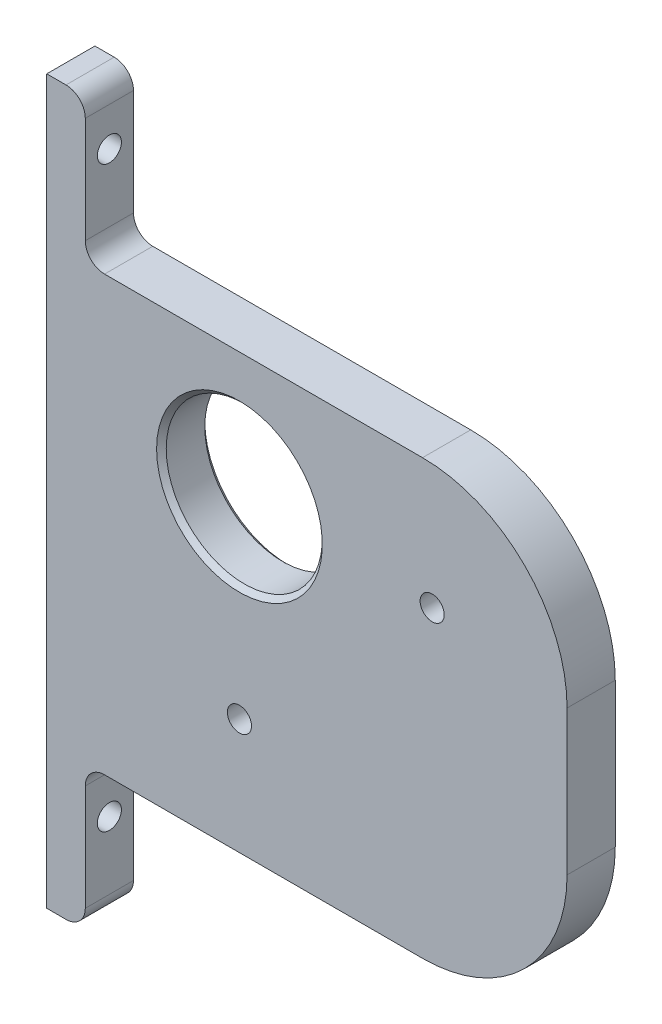
ISO-10303-21;
HEADER;
FILE_DESCRIPTION(('STEP AP214'),'2;1');
FILE_NAME('part.step','',(''),(''),'','','');
FILE_SCHEMA(('AUTOMOTIVE_DESIGN { 1 0 10303 214 1 1 1 1 }'));
ENDSEC;
DATA;
#1=APPLICATION_CONTEXT('core data for automotive mechanical design processes');
#2=APPLICATION_PROTOCOL_DEFINITION('international standard','automotive_design',2000,#1);
#3=PRODUCT_CONTEXT('',#1,'mechanical');
#4=PRODUCT('Part','Part','',(#3));
#5=PRODUCT_RELATED_PRODUCT_CATEGORY('part','',(#4));
#6=PRODUCT_DEFINITION_FORMATION('','',#4);
#7=PRODUCT_DEFINITION_CONTEXT('part definition',#1,'design');
#8=PRODUCT_DEFINITION('design','',#6,#7);
#9=PRODUCT_DEFINITION_SHAPE('','',#8);
#10=(LENGTH_UNIT() NAMED_UNIT(*) SI_UNIT(.MILLI.,.METRE.));
#11=(NAMED_UNIT(*) PLANE_ANGLE_UNIT() SI_UNIT($,.RADIAN.));
#12=(NAMED_UNIT(*) SI_UNIT($,.STERADIAN.) SOLID_ANGLE_UNIT());
#13=UNCERTAINTY_MEASURE_WITH_UNIT(LENGTH_MEASURE(1.E-05),#10,'distance_accuracy_value','');
#14=(GEOMETRIC_REPRESENTATION_CONTEXT(3) GLOBAL_UNCERTAINTY_ASSIGNED_CONTEXT((#13)) GLOBAL_UNIT_ASSIGNED_CONTEXT((#10,
#11,#12)) REPRESENTATION_CONTEXT('',''));
#15=CARTESIAN_POINT('',(0.,0.,0.));
#16=DIRECTION('',(0.,0.,1.));
#17=DIRECTION('',(1.,0.,0.));
#18=AXIS2_PLACEMENT_3D('',#15,#16,#17);
#19=CARTESIAN_POINT('',(0.,0.,5.));
#20=DIRECTION('',(0.,0.,-1.));
#21=DIRECTION('',(-1.,0.,0.));
#22=AXIS2_PLACEMENT_3D('',#19,#20,#21);
#23=PLANE('',#22);
#24=CARTESIAN_POINT('',(20.,47.,5.));
#25=DIRECTION('',(0.,0.,-1.));
#26=DIRECTION('',(-1.,0.,0.));
#27=AXIS2_PLACEMENT_3D('',#24,#25,#26);
#28=CIRCLE('',#27,8.6);
#29=CARTESIAN_POINT('',(11.4,47.,5.));
#30=VERTEX_POINT('',#29);
#31=EDGE_CURVE('E188',#30,#30,#28,.T.);
#32=ORIENTED_EDGE('',*,*,#31,.T.);
#33=EDGE_LOOP('',(#32));
#34=FACE_BOUND('',#33,.T.);
#35=CARTESIAN_POINT('',(40.,47.,5.));
#36=DIRECTION('',(0.,0.,-1.));
#37=DIRECTION('',(-1.,0.,0.));
#38=AXIS2_PLACEMENT_3D('',#35,#36,#37);
#39=CIRCLE('',#38,1.25);
#40=CARTESIAN_POINT('',(38.75,47.,5.));
#41=VERTEX_POINT('',#40);
#42=EDGE_CURVE('E296',#41,#41,#39,.T.);
#43=ORIENTED_EDGE('',*,*,#42,.T.);
#44=EDGE_LOOP('',(#43));
#45=FACE_BOUND('',#44,.T.);
#46=CARTESIAN_POINT('',(20.,27.,5.));
#47=DIRECTION('',(0.,0.,-1.));
#48=DIRECTION('',(-1.,0.,0.));
#49=AXIS2_PLACEMENT_3D('',#46,#47,#48);
#50=CIRCLE('',#49,1.25);
#51=CARTESIAN_POINT('',(18.75,27.,5.));
#52=VERTEX_POINT('',#51);
#53=EDGE_CURVE('E305',#52,#52,#50,.T.);
#54=ORIENTED_EDGE('',*,*,#53,.T.);
#55=EDGE_LOOP('',(#54));
#56=FACE_BOUND('',#55,.T.);
#57=DIRECTION('',(1.,0.,0.));
#58=VECTOR('',#57,1.);
#59=CARTESIAN_POINT('',(4.,15.,5.));
#60=LINE('',#59,#58);
#61=CARTESIAN_POINT('',(6.,15.,5.));
#62=VERTEX_POINT('',#61);
#63=CARTESIAN_POINT('',(39.,15.,5.));
#64=VERTEX_POINT('',#63);
#65=EDGE_CURVE('E245',#62,#64,#60,.T.);
#66=ORIENTED_EDGE('',*,*,#65,.T.);
#67=CARTESIAN_POINT('',(39.,30.,5.));
#68=DIRECTION('',(0.,0.,-1.));
#69=DIRECTION('',(-1.,0.,0.));
#70=AXIS2_PLACEMENT_3D('',#67,#68,#69);
#71=CIRCLE('',#70,15.);
#72=CARTESIAN_POINT('',(54.,30.,5.));
#73=VERTEX_POINT('',#72);
#74=EDGE_CURVE('E54',#64,#73,#71,.F.);
#75=ORIENTED_EDGE('',*,*,#74,.T.);
#76=DIRECTION('',(0.,1.,0.));
#77=VECTOR('',#76,1.);
#78=CARTESIAN_POINT('',(54.,0.,5.));
#79=LINE('',#78,#77);
#80=CARTESIAN_POINT('',(54.,45.,5.));
#81=VERTEX_POINT('',#80);
#82=EDGE_CURVE('E241',#73,#81,#79,.T.);
#83=ORIENTED_EDGE('',*,*,#82,.T.);
#84=CARTESIAN_POINT('',(39.,45.,5.));
#85=DIRECTION('',(0.,0.,-1.));
#86=DIRECTION('',(-1.,0.,0.));
#87=AXIS2_PLACEMENT_3D('',#84,#85,#86);
#88=CIRCLE('',#87,15.);
#89=CARTESIAN_POINT('',(39.,60.,5.));
#90=VERTEX_POINT('',#89);
#91=EDGE_CURVE('E65',#81,#90,#88,.F.);
#92=ORIENTED_EDGE('',*,*,#91,.T.);
#93=DIRECTION('',(-1.,0.,0.));
#94=VECTOR('',#93,1.);
#95=CARTESIAN_POINT('',(4.,60.,5.));
#96=LINE('',#95,#94);
#97=CARTESIAN_POINT('',(6.,60.,5.));
#98=VERTEX_POINT('',#97);
#99=EDGE_CURVE('E287',#90,#98,#96,.T.);
#100=ORIENTED_EDGE('',*,*,#99,.T.);
#101=CARTESIAN_POINT('',(6.,62.,5.));
#102=DIRECTION('',(0.,0.,-1.));
#103=DIRECTION('',(-1.,0.,0.));
#104=AXIS2_PLACEMENT_3D('',#101,#102,#103);
#105=CIRCLE('',#104,2.);
#106=CARTESIAN_POINT('',(4.,62.,5.));
#107=VERTEX_POINT('',#106);
#108=EDGE_CURVE('E225',#98,#107,#105,.T.);
#109=ORIENTED_EDGE('',*,*,#108,.T.);
#110=DIRECTION('',(0.,1.,0.));
#111=VECTOR('',#110,1.);
#112=CARTESIAN_POINT('',(4.,60.,5.));
#113=LINE('',#112,#111);
#114=CARTESIAN_POINT('',(4.,73.,5.));
#115=VERTEX_POINT('',#114);
#116=EDGE_CURVE('E284',#107,#115,#113,.T.);
#117=ORIENTED_EDGE('',*,*,#116,.T.);
#118=CARTESIAN_POINT('',(2.,73.,5.));
#119=DIRECTION('',(0.,0.,-1.));
#120=DIRECTION('',(-1.,0.,0.));
#121=AXIS2_PLACEMENT_3D('',#118,#119,#120);
#122=CIRCLE('',#121,2.);
#123=CARTESIAN_POINT('',(2.,75.,5.));
#124=VERTEX_POINT('',#123);
#125=EDGE_CURVE('E205',#115,#124,#122,.F.);
#126=ORIENTED_EDGE('',*,*,#125,.T.);
#127=DIRECTION('',(-1.,0.,0.));
#128=VECTOR('',#127,1.);
#129=CARTESIAN_POINT('',(0.,75.,5.));
#130=LINE('',#129,#128);
#131=CARTESIAN_POINT('',(0.,75.,5.));
#132=VERTEX_POINT('',#131);
#133=EDGE_CURVE('E166',#124,#132,#130,.T.);
#134=ORIENTED_EDGE('',*,*,#133,.T.);
#135=DIRECTION('',(0.,-1.,0.));
#136=VECTOR('',#135,1.);
#137=CARTESIAN_POINT('',(0.,0.,5.));
#138=LINE('',#137,#136);
#139=CARTESIAN_POINT('',(0.,0.,5.));
#140=VERTEX_POINT('',#139);
#141=EDGE_CURVE('E165',#132,#140,#138,.T.);
#142=ORIENTED_EDGE('',*,*,#141,.T.);
#143=DIRECTION('',(1.,0.,0.));
#144=VECTOR('',#143,1.);
#145=CARTESIAN_POINT('',(0.,0.,5.));
#146=LINE('',#145,#144);
#147=CARTESIAN_POINT('',(2.,0.,5.));
#148=VERTEX_POINT('',#147);
#149=EDGE_CURVE('E151',#140,#148,#146,.T.);
#150=ORIENTED_EDGE('',*,*,#149,.T.);
#151=CARTESIAN_POINT('',(2.,2.,5.));
#152=DIRECTION('',(0.,0.,-1.));
#153=DIRECTION('',(-1.,0.,0.));
#154=AXIS2_PLACEMENT_3D('',#151,#152,#153);
#155=CIRCLE('',#154,2.);
#156=CARTESIAN_POINT('',(4.,2.,5.));
#157=VERTEX_POINT('',#156);
#158=EDGE_CURVE('E203',#148,#157,#155,.F.);
#159=ORIENTED_EDGE('',*,*,#158,.T.);
#160=DIRECTION('',(0.,1.,0.));
#161=VECTOR('',#160,1.);
#162=CARTESIAN_POINT('',(4.,0.,5.));
#163=LINE('',#162,#161);
#164=CARTESIAN_POINT('',(4.,13.,5.));
#165=VERTEX_POINT('',#164);
#166=EDGE_CURVE('E162',#157,#165,#163,.T.);
#167=ORIENTED_EDGE('',*,*,#166,.T.);
#168=CARTESIAN_POINT('',(6.,13.,5.));
#169=DIRECTION('',(0.,0.,-1.));
#170=DIRECTION('',(-1.,0.,0.));
#171=AXIS2_PLACEMENT_3D('',#168,#169,#170);
#172=CIRCLE('',#171,2.);
#173=EDGE_CURVE('E230',#165,#62,#172,.T.);
#174=ORIENTED_EDGE('',*,*,#173,.T.);
#175=EDGE_LOOP('',(#66,#75,#83,#92,#100,#109,#117,#126,#134,#142,#150,#159,#167,#174));
#176=FACE_BOUND('',#175,.T.);
#177=ADVANCED_FACE('F50',(#34,#45,#56,#176),#23,.F.);
#178=CARTESIAN_POINT('',(0.,0.,0.));
#179=DIRECTION('',(0.,0.,-1.));
#180=DIRECTION('',(-1.,0.,0.));
#181=AXIS2_PLACEMENT_3D('',#178,#179,#180);
#182=PLANE('',#181);
#183=DIRECTION('',(0.,1.,0.));
#184=VECTOR('',#183,1.);
#185=CARTESIAN_POINT('',(54.,60.,0.));
#186=LINE('',#185,#184);
#187=CARTESIAN_POINT('',(54.,30.,0.));
#188=VERTEX_POINT('',#187);
#189=CARTESIAN_POINT('',(54.,45.,0.));
#190=VERTEX_POINT('',#189);
#191=EDGE_CURVE('E251',#188,#190,#186,.T.);
#192=ORIENTED_EDGE('',*,*,#191,.F.);
#193=CARTESIAN_POINT('',(39.,30.,0.));
#194=DIRECTION('',(0.,0.,-1.));
#195=DIRECTION('',(-1.,0.,0.));
#196=AXIS2_PLACEMENT_3D('',#193,#194,#195);
#197=CIRCLE('',#196,15.);
#198=CARTESIAN_POINT('',(39.,15.,0.));
#199=VERTEX_POINT('',#198);
#200=EDGE_CURVE('E237',#188,#199,#197,.T.);
#201=ORIENTED_EDGE('',*,*,#200,.T.);
#202=DIRECTION('',(1.,0.,0.));
#203=VECTOR('',#202,1.);
#204=CARTESIAN_POINT('',(4.,15.,0.));
#205=LINE('',#204,#203);
#206=CARTESIAN_POINT('',(6.,15.,0.));
#207=VERTEX_POINT('',#206);
#208=EDGE_CURVE('E256',#207,#199,#205,.T.);
#209=ORIENTED_EDGE('',*,*,#208,.F.);
#210=CARTESIAN_POINT('',(6.,13.,0.));
#211=DIRECTION('',(0.,0.,-1.));
#212=DIRECTION('',(-1.,0.,0.));
#213=AXIS2_PLACEMENT_3D('',#210,#211,#212);
#214=CIRCLE('',#213,2.);
#215=CARTESIAN_POINT('',(4.,13.,0.));
#216=VERTEX_POINT('',#215);
#217=EDGE_CURVE('E222',#207,#216,#214,.F.);
#218=ORIENTED_EDGE('',*,*,#217,.T.);
#219=DIRECTION('',(0.,1.,0.));
#220=VECTOR('',#219,1.);
#221=CARTESIAN_POINT('',(4.,0.,0.));
#222=LINE('',#221,#220);
#223=CARTESIAN_POINT('',(4.,2.,0.));
#224=VERTEX_POINT('',#223);
#225=EDGE_CURVE('E265',#224,#216,#222,.T.);
#226=ORIENTED_EDGE('',*,*,#225,.F.);
#227=CARTESIAN_POINT('',(2.,2.,0.));
#228=DIRECTION('',(0.,0.,-1.));
#229=DIRECTION('',(-1.,0.,0.));
#230=AXIS2_PLACEMENT_3D('',#227,#228,#229);
#231=CIRCLE('',#230,2.);
#232=CARTESIAN_POINT('',(2.,0.,0.));
#233=VERTEX_POINT('',#232);
#234=EDGE_CURVE('E197',#224,#233,#231,.T.);
#235=ORIENTED_EDGE('',*,*,#234,.T.);
#236=DIRECTION('',(1.,0.,0.));
#237=VECTOR('',#236,1.);
#238=CARTESIAN_POINT('',(0.,0.,0.));
#239=LINE('',#238,#237);
#240=CARTESIAN_POINT('',(0.,0.,0.));
#241=VERTEX_POINT('',#240);
#242=EDGE_CURVE('E270',#241,#233,#239,.T.);
#243=ORIENTED_EDGE('',*,*,#242,.F.);
#244=DIRECTION('',(0.,-1.,0.));
#245=VECTOR('',#244,1.);
#246=CARTESIAN_POINT('',(0.,0.,0.));
#247=LINE('',#246,#245);
#248=CARTESIAN_POINT('',(0.,75.,0.));
#249=VERTEX_POINT('',#248);
#250=EDGE_CURVE('E173',#249,#241,#247,.T.);
#251=ORIENTED_EDGE('',*,*,#250,.F.);
#252=DIRECTION('',(-1.,0.,0.));
#253=VECTOR('',#252,1.);
#254=CARTESIAN_POINT('',(0.,75.,0.));
#255=LINE('',#254,#253);
#256=CARTESIAN_POINT('',(2.,75.,0.));
#257=VERTEX_POINT('',#256);
#258=EDGE_CURVE('E169',#257,#249,#255,.T.);
#259=ORIENTED_EDGE('',*,*,#258,.F.);
#260=CARTESIAN_POINT('',(2.,73.,0.));
#261=DIRECTION('',(0.,0.,-1.));
#262=DIRECTION('',(-1.,0.,0.));
#263=AXIS2_PLACEMENT_3D('',#260,#261,#262);
#264=CIRCLE('',#263,2.);
#265=CARTESIAN_POINT('',(4.,73.,0.));
#266=VERTEX_POINT('',#265);
#267=EDGE_CURVE('E200',#257,#266,#264,.T.);
#268=ORIENTED_EDGE('',*,*,#267,.T.);
#269=DIRECTION('',(0.,1.,0.));
#270=VECTOR('',#269,1.);
#271=CARTESIAN_POINT('',(4.,60.,0.));
#272=LINE('',#271,#270);
#273=CARTESIAN_POINT('',(4.,62.,0.));
#274=VERTEX_POINT('',#273);
#275=EDGE_CURVE('E264',#274,#266,#272,.T.);
#276=ORIENTED_EDGE('',*,*,#275,.F.);
#277=CARTESIAN_POINT('',(6.,62.,0.));
#278=DIRECTION('',(0.,0.,-1.));
#279=DIRECTION('',(-1.,0.,0.));
#280=AXIS2_PLACEMENT_3D('',#277,#278,#279);
#281=CIRCLE('',#280,2.);
#282=CARTESIAN_POINT('',(6.,60.,0.));
#283=VERTEX_POINT('',#282);
#284=EDGE_CURVE('E219',#274,#283,#281,.F.);
#285=ORIENTED_EDGE('',*,*,#284,.T.);
#286=DIRECTION('',(-1.,0.,0.));
#287=VECTOR('',#286,1.);
#288=CARTESIAN_POINT('',(4.,60.,0.));
#289=LINE('',#288,#287);
#290=CARTESIAN_POINT('',(39.,60.,0.));
#291=VERTEX_POINT('',#290);
#292=EDGE_CURVE('E263',#291,#283,#289,.T.);
#293=ORIENTED_EDGE('',*,*,#292,.F.);
#294=CARTESIAN_POINT('',(39.,45.,0.));
#295=DIRECTION('',(0.,0.,-1.));
#296=DIRECTION('',(-1.,0.,0.));
#297=AXIS2_PLACEMENT_3D('',#294,#295,#296);
#298=CIRCLE('',#297,15.);
#299=EDGE_CURVE('E234',#291,#190,#298,.T.);
#300=ORIENTED_EDGE('',*,*,#299,.T.);
#301=EDGE_LOOP('',(#192,#201,#209,#218,#226,#235,#243,#251,#259,#268,#276,#285,#293,#300));
#302=FACE_BOUND('',#301,.T.);
#303=CARTESIAN_POINT('',(20.,47.,0.));
#304=DIRECTION('',(0.,0.,-1.));
#305=DIRECTION('',(-1.,0.,0.));
#306=AXIS2_PLACEMENT_3D('',#303,#304,#305);
#307=CIRCLE('',#306,8.60000000000001);
#308=CARTESIAN_POINT('',(11.4,47.,0.));
#309=VERTEX_POINT('',#308);
#310=EDGE_CURVE('E189',#309,#309,#307,.F.);
#311=ORIENTED_EDGE('',*,*,#310,.T.);
#312=EDGE_LOOP('',(#311));
#313=FACE_BOUND('',#312,.T.);
#314=CARTESIAN_POINT('',(40.,47.,0.));
#315=DIRECTION('',(0.,0.,-1.));
#316=DIRECTION('',(-1.,0.,0.));
#317=AXIS2_PLACEMENT_3D('',#314,#315,#316);
#318=CIRCLE('',#317,1.25);
#319=CARTESIAN_POINT('',(38.75,47.,0.));
#320=VERTEX_POINT('',#319);
#321=EDGE_CURVE('E304',#320,#320,#318,.T.);
#322=ORIENTED_EDGE('',*,*,#321,.F.);
#323=EDGE_LOOP('',(#322));
#324=FACE_BOUND('',#323,.T.);
#325=CARTESIAN_POINT('',(20.,27.,0.));
#326=DIRECTION('',(0.,0.,-1.));
#327=DIRECTION('',(-1.,0.,0.));
#328=AXIS2_PLACEMENT_3D('',#325,#326,#327);
#329=CIRCLE('',#328,1.25);
#330=CARTESIAN_POINT('',(18.75,27.,0.));
#331=VERTEX_POINT('',#330);
#332=EDGE_CURVE('E247',#331,#331,#329,.T.);
#333=ORIENTED_EDGE('',*,*,#332,.F.);
#334=EDGE_LOOP('',(#333));
#335=FACE_BOUND('',#334,.T.);
#336=ADVANCED_FACE('F258',(#302,#313,#324,#335),#182,.T.);
#337=CARTESIAN_POINT('',(0.,0.,5.));
#338=DIRECTION('',(1.,0.,0.));
#339=DIRECTION('',(0.,0.,-1.));
#340=AXIS2_PLACEMENT_3D('',#337,#338,#339);
#341=PLANE('',#340);
#342=CARTESIAN_POINT('',(0.,69.,2.5));
#343=DIRECTION('',(1.,0.,0.));
#344=DIRECTION('',(0.,0.,-1.));
#345=AXIS2_PLACEMENT_3D('',#342,#343,#344);
#346=CIRCLE('',#345,1.25);
#347=CARTESIAN_POINT('',(0.,69.,1.25));
#348=VERTEX_POINT('',#347);
#349=EDGE_CURVE('E278',#348,#348,#346,.T.);
#350=ORIENTED_EDGE('',*,*,#349,.T.);
#351=EDGE_LOOP('',(#350));
#352=FACE_BOUND('',#351,.T.);
#353=CARTESIAN_POINT('',(0.,9.,2.5));
#354=DIRECTION('',(1.,0.,0.));
#355=DIRECTION('',(0.,0.,-1.));
#356=AXIS2_PLACEMENT_3D('',#353,#354,#355);
#357=CIRCLE('',#356,1.25);
#358=CARTESIAN_POINT('',(0.,9.,1.25));
#359=VERTEX_POINT('',#358);
#360=EDGE_CURVE('E276',#359,#359,#357,.T.);
#361=ORIENTED_EDGE('',*,*,#360,.T.);
#362=EDGE_LOOP('',(#361));
#363=FACE_BOUND('',#362,.T.);
#364=ORIENTED_EDGE('',*,*,#250,.T.);
#365=DIRECTION('',(0.,0.,-1.));
#366=VECTOR('',#365,1.);
#367=CARTESIAN_POINT('',(0.,0.,5.));
#368=LINE('',#367,#366);
#369=EDGE_CURVE('E157',#140,#241,#368,.T.);
#370=ORIENTED_EDGE('',*,*,#369,.F.);
#371=ORIENTED_EDGE('',*,*,#141,.F.);
#372=DIRECTION('',(0.,0.,-1.));
#373=VECTOR('',#372,1.);
#374=CARTESIAN_POINT('',(0.,75.,5.));
#375=LINE('',#374,#373);
#376=EDGE_CURVE('E176',#132,#249,#375,.T.);
#377=ORIENTED_EDGE('',*,*,#376,.T.);
#378=EDGE_LOOP('',(#364,#370,#371,#377));
#379=FACE_BOUND('',#378,.T.);
#380=ADVANCED_FACE('F171',(#352,#363,#379),#341,.F.);
#381=CARTESIAN_POINT('',(0.,0.,5.));
#382=DIRECTION('',(0.,1.,0.));
#383=DIRECTION('',(0.,0.,1.));
#384=AXIS2_PLACEMENT_3D('',#381,#382,#383);
#385=PLANE('',#384);
#386=ORIENTED_EDGE('',*,*,#242,.T.);
#387=DIRECTION('',(0.,0.,-1.));
#388=VECTOR('',#387,1.);
#389=CARTESIAN_POINT('',(2.,0.,5.));
#390=LINE('',#389,#388);
#391=EDGE_CURVE('E159',#233,#148,#390,.F.);
#392=ORIENTED_EDGE('',*,*,#391,.T.);
#393=ORIENTED_EDGE('',*,*,#149,.F.);
#394=ORIENTED_EDGE('',*,*,#369,.T.);
#395=EDGE_LOOP('',(#386,#392,#393,#394));
#396=FACE_BOUND('',#395,.T.);
#397=ADVANCED_FACE('F152',(#396),#385,.F.);
#398=CARTESIAN_POINT('',(4.,0.,5.));
#399=DIRECTION('',(-1.,0.,0.));
#400=DIRECTION('',(0.,0.,1.));
#401=AXIS2_PLACEMENT_3D('',#398,#399,#400);
#402=PLANE('',#401);
#403=CARTESIAN_POINT('',(4.,9.,2.5));
#404=DIRECTION('',(1.,0.,0.));
#405=DIRECTION('',(0.,0.,1.));
#406=AXIS2_PLACEMENT_3D('',#403,#404,#405);
#407=CIRCLE('',#406,1.25);
#408=CARTESIAN_POINT('',(4.,9.,3.75));
#409=VERTEX_POINT('',#408);
#410=EDGE_CURVE('E293',#409,#409,#407,.T.);
#411=ORIENTED_EDGE('',*,*,#410,.F.);
#412=EDGE_LOOP('',(#411));
#413=FACE_BOUND('',#412,.T.);
#414=ORIENTED_EDGE('',*,*,#166,.F.);
#415=DIRECTION('',(0.,0.,-1.));
#416=VECTOR('',#415,1.);
#417=CARTESIAN_POINT('',(4.,2.,5.));
#418=LINE('',#417,#416);
#419=EDGE_CURVE('E192',#157,#224,#418,.T.);
#420=ORIENTED_EDGE('',*,*,#419,.T.);
#421=ORIENTED_EDGE('',*,*,#225,.T.);
#422=DIRECTION('',(0.,0.,-1.));
#423=VECTOR('',#422,1.);
#424=CARTESIAN_POINT('',(4.,13.,5.));
#425=LINE('',#424,#423);
#426=EDGE_CURVE('E195',#216,#165,#425,.F.);
#427=ORIENTED_EDGE('',*,*,#426,.T.);
#428=EDGE_LOOP('',(#414,#420,#421,#427));
#429=FACE_BOUND('',#428,.T.);
#430=ADVANCED_FACE('F362',(#413,#429),#402,.F.);
#431=CARTESIAN_POINT('',(4.,15.,5.));
#432=DIRECTION('',(0.,1.,0.));
#433=DIRECTION('',(0.,0.,1.));
#434=AXIS2_PLACEMENT_3D('',#431,#432,#433);
#435=PLANE('',#434);
#436=ORIENTED_EDGE('',*,*,#208,.T.);
#437=DIRECTION('',(0.,0.,-1.));
#438=VECTOR('',#437,1.);
#439=CARTESIAN_POINT('',(39.,15.,5.));
#440=LINE('',#439,#438);
#441=EDGE_CURVE('E69',#199,#64,#440,.F.);
#442=ORIENTED_EDGE('',*,*,#441,.T.);
#443=ORIENTED_EDGE('',*,*,#65,.F.);
#444=DIRECTION('',(0.,0.,-1.));
#445=VECTOR('',#444,1.);
#446=CARTESIAN_POINT('',(6.,15.,0.));
#447=LINE('',#446,#445);
#448=EDGE_CURVE('E220',#62,#207,#447,.T.);
#449=ORIENTED_EDGE('',*,*,#448,.T.);
#450=EDGE_LOOP('',(#436,#442,#443,#449));
#451=FACE_BOUND('',#450,.T.);
#452=ADVANCED_FACE('F260',(#451),#435,.F.);
#453=CARTESIAN_POINT('',(4.,60.,5.));
#454=DIRECTION('',(0.,-1.,0.));
#455=DIRECTION('',(0.,0.,-1.));
#456=AXIS2_PLACEMENT_3D('',#453,#454,#455);
#457=PLANE('',#456);
#458=ORIENTED_EDGE('',*,*,#99,.F.);
#459=DIRECTION('',(0.,0.,-1.));
#460=VECTOR('',#459,1.);
#461=CARTESIAN_POINT('',(39.,60.,5.));
#462=LINE('',#461,#460);
#463=EDGE_CURVE('E11',#90,#291,#462,.T.);
#464=ORIENTED_EDGE('',*,*,#463,.T.);
#465=ORIENTED_EDGE('',*,*,#292,.T.);
#466=DIRECTION('',(0.,0.,-1.));
#467=VECTOR('',#466,1.);
#468=CARTESIAN_POINT('',(6.,60.,5.));
#469=LINE('',#468,#467);
#470=EDGE_CURVE('E211',#283,#98,#469,.F.);
#471=ORIENTED_EDGE('',*,*,#470,.T.);
#472=EDGE_LOOP('',(#458,#464,#465,#471));
#473=FACE_BOUND('',#472,.T.);
#474=ADVANCED_FACE('F311',(#473),#457,.F.);
#475=CARTESIAN_POINT('',(4.,60.,5.));
#476=DIRECTION('',(-1.,0.,0.));
#477=DIRECTION('',(0.,0.,1.));
#478=AXIS2_PLACEMENT_3D('',#475,#476,#477);
#479=PLANE('',#478);
#480=CARTESIAN_POINT('',(4.,69.,2.5));
#481=DIRECTION('',(1.,0.,0.));
#482=DIRECTION('',(0.,0.,-1.));
#483=AXIS2_PLACEMENT_3D('',#480,#481,#482);
#484=CIRCLE('',#483,1.25);
#485=CARTESIAN_POINT('',(4.,69.,1.25));
#486=VERTEX_POINT('',#485);
#487=EDGE_CURVE('E292',#486,#486,#484,.T.);
#488=ORIENTED_EDGE('',*,*,#487,.F.);
#489=EDGE_LOOP('',(#488));
#490=FACE_BOUND('',#489,.T.);
#491=ORIENTED_EDGE('',*,*,#275,.T.);
#492=DIRECTION('',(0.,0.,-1.));
#493=VECTOR('',#492,1.);
#494=CARTESIAN_POINT('',(4.,73.,5.));
#495=LINE('',#494,#493);
#496=EDGE_CURVE('E215',#266,#115,#495,.F.);
#497=ORIENTED_EDGE('',*,*,#496,.T.);
#498=ORIENTED_EDGE('',*,*,#116,.F.);
#499=DIRECTION('',(0.,0.,-1.));
#500=VECTOR('',#499,1.);
#501=CARTESIAN_POINT('',(4.,62.,0.));
#502=LINE('',#501,#500);
#503=EDGE_CURVE('E206',#107,#274,#502,.T.);
#504=ORIENTED_EDGE('',*,*,#503,.T.);
#505=EDGE_LOOP('',(#491,#497,#498,#504));
#506=FACE_BOUND('',#505,.T.);
#507=ADVANCED_FACE('F323',(#490,#506),#479,.F.);
#508=CARTESIAN_POINT('',(0.,75.,5.));
#509=DIRECTION('',(0.,-1.,0.));
#510=DIRECTION('',(0.,0.,-1.));
#511=AXIS2_PLACEMENT_3D('',#508,#509,#510);
#512=PLANE('',#511);
#513=ORIENTED_EDGE('',*,*,#133,.F.);
#514=DIRECTION('',(0.,0.,-1.));
#515=VECTOR('',#514,1.);
#516=CARTESIAN_POINT('',(2.,75.,5.));
#517=LINE('',#516,#515);
#518=EDGE_CURVE('E207',#124,#257,#517,.T.);
#519=ORIENTED_EDGE('',*,*,#518,.T.);
#520=ORIENTED_EDGE('',*,*,#258,.T.);
#521=ORIENTED_EDGE('',*,*,#376,.F.);
#522=EDGE_LOOP('',(#513,#519,#520,#521));
#523=FACE_BOUND('',#522,.T.);
#524=ADVANCED_FACE('F272',(#523),#512,.F.);
#525=CARTESIAN_POINT('',(20.,47.,5.));
#526=DIRECTION('',(0.,0.,-1.));
#527=DIRECTION('',(-1.,0.,0.));
#528=AXIS2_PLACEMENT_3D('',#525,#526,#527);
#529=CYLINDRICAL_SURFACE('',#528,8.1);
#530=CARTESIAN_POINT('',(20.,47.,4.5));
#531=DIRECTION('',(0.,0.,-1.));
#532=DIRECTION('',(-1.,0.,0.));
#533=AXIS2_PLACEMENT_3D('',#530,#531,#532);
#534=CIRCLE('',#533,8.1);
#535=CARTESIAN_POINT('',(11.9,47.,4.5));
#536=VERTEX_POINT('',#535);
#537=EDGE_CURVE('E177',#536,#536,#534,.F.);
#538=ORIENTED_EDGE('',*,*,#537,.T.);
#539=EDGE_LOOP('',(#538));
#540=FACE_BOUND('',#539,.T.);
#541=CARTESIAN_POINT('',(20.,47.,0.500000000000011));
#542=DIRECTION('',(0.,0.,-1.));
#543=DIRECTION('',(-1.,0.,0.));
#544=AXIS2_PLACEMENT_3D('',#541,#542,#543);
#545=CIRCLE('',#544,8.1);
#546=CARTESIAN_POINT('',(11.9,47.,0.500000000000011));
#547=VERTEX_POINT('',#546);
#548=EDGE_CURVE('E172',#547,#547,#545,.T.);
#549=ORIENTED_EDGE('',*,*,#548,.T.);
#550=EDGE_LOOP('',(#549));
#551=FACE_BOUND('',#550,.T.);
#552=ADVANCED_FACE('F347',(#540,#551),#529,.F.);
#553=CARTESIAN_POINT('',(-1.,69.,2.5));
#554=DIRECTION('',(1.,0.,0.));
#555=DIRECTION('',(0.,0.,-1.));
#556=AXIS2_PLACEMENT_3D('',#553,#554,#555);
#557=CYLINDRICAL_SURFACE('',#556,1.25);
#558=ORIENTED_EDGE('',*,*,#487,.T.);
#559=EDGE_LOOP('',(#558));
#560=FACE_BOUND('',#559,.T.);
#561=ORIENTED_EDGE('',*,*,#349,.F.);
#562=EDGE_LOOP('',(#561));
#563=FACE_BOUND('',#562,.T.);
#564=ADVANCED_FACE('F409',(#560,#563),#557,.F.);
#565=CARTESIAN_POINT('',(-1.,9.,2.5));
#566=DIRECTION('',(1.,0.,0.));
#567=DIRECTION('',(0.,0.,-1.));
#568=AXIS2_PLACEMENT_3D('',#565,#566,#567);
#569=CYLINDRICAL_SURFACE('',#568,1.25);
#570=ORIENTED_EDGE('',*,*,#410,.T.);
#571=EDGE_LOOP('',(#570));
#572=FACE_BOUND('',#571,.T.);
#573=ORIENTED_EDGE('',*,*,#360,.F.);
#574=EDGE_LOOP('',(#573));
#575=FACE_BOUND('',#574,.T.);
#576=ADVANCED_FACE('F398',(#572,#575),#569,.F.);
#577=CARTESIAN_POINT('',(20.,27.,120.));
#578=DIRECTION('',(0.,0.,-1.));
#579=DIRECTION('',(-1.,0.,0.));
#580=AXIS2_PLACEMENT_3D('',#577,#578,#579);
#581=CYLINDRICAL_SURFACE('',#580,1.25);
#582=ORIENTED_EDGE('',*,*,#332,.T.);
#583=EDGE_LOOP('',(#582));
#584=FACE_BOUND('',#583,.T.);
#585=ORIENTED_EDGE('',*,*,#53,.F.);
#586=EDGE_LOOP('',(#585));
#587=FACE_BOUND('',#586,.T.);
#588=ADVANCED_FACE('F399',(#584,#587),#581,.F.);
#589=CARTESIAN_POINT('',(40.,47.,120.));
#590=DIRECTION('',(0.,0.,-1.));
#591=DIRECTION('',(-1.,0.,0.));
#592=AXIS2_PLACEMENT_3D('',#589,#590,#591);
#593=CYLINDRICAL_SURFACE('',#592,1.25);
#594=ORIENTED_EDGE('',*,*,#321,.T.);
#595=EDGE_LOOP('',(#594));
#596=FACE_BOUND('',#595,.T.);
#597=ORIENTED_EDGE('',*,*,#42,.F.);
#598=EDGE_LOOP('',(#597));
#599=FACE_BOUND('',#598,.T.);
#600=ADVANCED_FACE('F378',(#596,#599),#593,.F.);
#601=CARTESIAN_POINT('',(20.,47.,4.5));
#602=DIRECTION('',(0.,0.,1.));
#603=DIRECTION('',(1.,0.,0.));
#604=AXIS2_PLACEMENT_3D('',#601,#602,#603);
#605=CONICAL_SURFACE('',#604,8.1,0.785398163397448);
#606=ORIENTED_EDGE('',*,*,#31,.F.);
#607=EDGE_LOOP('',(#606));
#608=FACE_BOUND('',#607,.T.);
#609=ORIENTED_EDGE('',*,*,#537,.F.);
#610=EDGE_LOOP('',(#609));
#611=FACE_BOUND('',#610,.T.);
#612=ADVANCED_FACE('F374',(#608,#611),#605,.F.);
#613=CARTESIAN_POINT('',(20.,47.,0.));
#614=DIRECTION('',(0.,0.,-1.));
#615=DIRECTION('',(-1.,0.,0.));
#616=AXIS2_PLACEMENT_3D('',#613,#614,#615);
#617=CONICAL_SURFACE('',#616,8.60000000000001,0.785398163397448);
#618=ORIENTED_EDGE('',*,*,#548,.F.);
#619=EDGE_LOOP('',(#618));
#620=FACE_BOUND('',#619,.T.);
#621=ORIENTED_EDGE('',*,*,#310,.F.);
#622=EDGE_LOOP('',(#621));
#623=FACE_BOUND('',#622,.T.);
#624=ADVANCED_FACE('F380',(#620,#623),#617,.F.);
#625=CARTESIAN_POINT('',(54.,60.,10.));
#626=DIRECTION('',(-1.,0.,0.));
#627=DIRECTION('',(0.,-1.,0.));
#628=AXIS2_PLACEMENT_3D('',#625,#626,#627);
#629=PLANE('',#628);
#630=ORIENTED_EDGE('',*,*,#82,.F.);
#631=DIRECTION('',(0.,0.,-1.));
#632=VECTOR('',#631,1.);
#633=CARTESIAN_POINT('',(54.,30.,10.));
#634=LINE('',#633,#632);
#635=EDGE_CURVE('E232',#73,#188,#634,.T.);
#636=ORIENTED_EDGE('',*,*,#635,.T.);
#637=ORIENTED_EDGE('',*,*,#191,.T.);
#638=DIRECTION('',(0.,0.,-1.));
#639=VECTOR('',#638,1.);
#640=CARTESIAN_POINT('',(54.,45.,10.));
#641=LINE('',#640,#639);
#642=EDGE_CURVE('E227',#190,#81,#641,.F.);
#643=ORIENTED_EDGE('',*,*,#642,.T.);
#644=EDGE_LOOP('',(#630,#636,#637,#643));
#645=FACE_BOUND('',#644,.T.);
#646=ADVANCED_FACE('F249',(#645),#629,.F.);
#647=CARTESIAN_POINT('',(2.,2.,5.));
#648=DIRECTION('',(0.,0.,-1.));
#649=DIRECTION('',(-1.,0.,0.));
#650=AXIS2_PLACEMENT_3D('',#647,#648,#649);
#651=CYLINDRICAL_SURFACE('',#650,2.);
#652=ORIENTED_EDGE('',*,*,#158,.F.);
#653=ORIENTED_EDGE('',*,*,#391,.F.);
#654=ORIENTED_EDGE('',*,*,#234,.F.);
#655=ORIENTED_EDGE('',*,*,#419,.F.);
#656=EDGE_LOOP('',(#652,#653,#654,#655));
#657=FACE_BOUND('',#656,.T.);
#658=ADVANCED_FACE('F327',(#657),#651,.T.);
#659=CARTESIAN_POINT('',(2.,73.,5.));
#660=DIRECTION('',(0.,0.,-1.));
#661=DIRECTION('',(-1.,0.,0.));
#662=AXIS2_PLACEMENT_3D('',#659,#660,#661);
#663=CYLINDRICAL_SURFACE('',#662,2.);
#664=ORIENTED_EDGE('',*,*,#125,.F.);
#665=ORIENTED_EDGE('',*,*,#496,.F.);
#666=ORIENTED_EDGE('',*,*,#267,.F.);
#667=ORIENTED_EDGE('',*,*,#518,.F.);
#668=EDGE_LOOP('',(#664,#665,#666,#667));
#669=FACE_BOUND('',#668,.T.);
#670=ADVANCED_FACE('F330',(#669),#663,.T.);
#671=CARTESIAN_POINT('',(6.,62.,5.));
#672=DIRECTION('',(0.,0.,1.));
#673=DIRECTION('',(1.,0.,0.));
#674=AXIS2_PLACEMENT_3D('',#671,#672,#673);
#675=CYLINDRICAL_SURFACE('',#674,2.);
#676=ORIENTED_EDGE('',*,*,#108,.F.);
#677=ORIENTED_EDGE('',*,*,#470,.F.);
#678=ORIENTED_EDGE('',*,*,#284,.F.);
#679=ORIENTED_EDGE('',*,*,#503,.F.);
#680=EDGE_LOOP('',(#676,#677,#678,#679));
#681=FACE_BOUND('',#680,.T.);
#682=ADVANCED_FACE('F319',(#681),#675,.F.);
#683=CARTESIAN_POINT('',(6.,13.,5.));
#684=DIRECTION('',(0.,0.,1.));
#685=DIRECTION('',(1.,0.,0.));
#686=AXIS2_PLACEMENT_3D('',#683,#684,#685);
#687=CYLINDRICAL_SURFACE('',#686,2.);
#688=ORIENTED_EDGE('',*,*,#173,.F.);
#689=ORIENTED_EDGE('',*,*,#426,.F.);
#690=ORIENTED_EDGE('',*,*,#217,.F.);
#691=ORIENTED_EDGE('',*,*,#448,.F.);
#692=EDGE_LOOP('',(#688,#689,#690,#691));
#693=FACE_BOUND('',#692,.T.);
#694=ADVANCED_FACE('F334',(#693),#687,.F.);
#695=CARTESIAN_POINT('',(39.,30.,10.));
#696=DIRECTION('',(0.,0.,-1.));
#697=DIRECTION('',(-1.,0.,0.));
#698=AXIS2_PLACEMENT_3D('',#695,#696,#697);
#699=CYLINDRICAL_SURFACE('',#698,15.);
#700=ORIENTED_EDGE('',*,*,#74,.F.);
#701=ORIENTED_EDGE('',*,*,#441,.F.);
#702=ORIENTED_EDGE('',*,*,#200,.F.);
#703=ORIENTED_EDGE('',*,*,#635,.F.);
#704=EDGE_LOOP('',(#700,#701,#702,#703));
#705=FACE_BOUND('',#704,.T.);
#706=ADVANCED_FACE('F253',(#705),#699,.T.);
#707=CARTESIAN_POINT('',(39.,45.,5.));
#708=DIRECTION('',(0.,0.,-1.));
#709=DIRECTION('',(-1.,0.,0.));
#710=AXIS2_PLACEMENT_3D('',#707,#708,#709);
#711=CYLINDRICAL_SURFACE('',#710,15.);
#712=ORIENTED_EDGE('',*,*,#91,.F.);
#713=ORIENTED_EDGE('',*,*,#642,.F.);
#714=ORIENTED_EDGE('',*,*,#299,.F.);
#715=ORIENTED_EDGE('',*,*,#463,.F.);
#716=EDGE_LOOP('',(#712,#713,#714,#715));
#717=FACE_BOUND('',#716,.T.);
#718=ADVANCED_FACE('F47',(#717),#711,.T.);
#719=CLOSED_SHELL('',(#177,#336,#380,#397,#430,#452,#474,#507,#524,#552,#564,#576,#588,#600,
#612,#624,#646,#658,#670,#682,#694,#706,#718));
#720=MANIFOLD_SOLID_BREP('B2',#719);
#721=ADVANCED_BREP_SHAPE_REPRESENTATION('',(#18,#720),#14);
#722=SHAPE_DEFINITION_REPRESENTATION(#9,#721);
ENDSEC;
END-ISO-10303-21;
